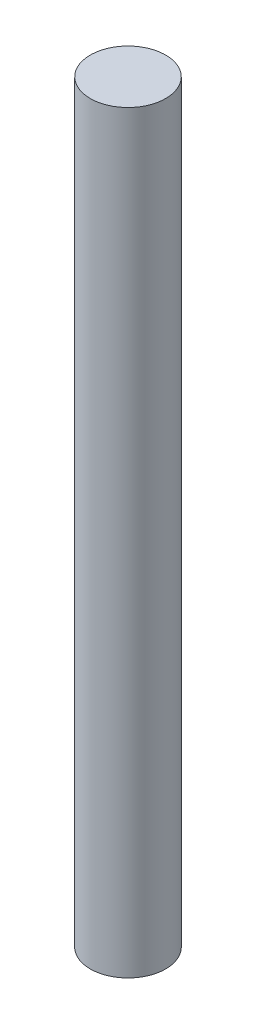
ISO-10303-21;
HEADER;
FILE_DESCRIPTION(('STEP AP214'),'2;1');
FILE_NAME('part.step','',(''),(''),'','','');
FILE_SCHEMA(('AUTOMOTIVE_DESIGN { 1 0 10303 214 1 1 1 1 }'));
ENDSEC;
DATA;
#1=APPLICATION_CONTEXT('core data for automotive mechanical design processes');
#2=APPLICATION_PROTOCOL_DEFINITION('international standard','automotive_design',2000,#1);
#3=PRODUCT_CONTEXT('',#1,'mechanical');
#4=PRODUCT('Part','Part','',(#3));
#5=PRODUCT_RELATED_PRODUCT_CATEGORY('part','',(#4));
#6=PRODUCT_DEFINITION_FORMATION('','',#4);
#7=PRODUCT_DEFINITION_CONTEXT('part definition',#1,'design');
#8=PRODUCT_DEFINITION('design','',#6,#7);
#9=PRODUCT_DEFINITION_SHAPE('','',#8);
#10=(LENGTH_UNIT() NAMED_UNIT(*) SI_UNIT(.MILLI.,.METRE.));
#11=(NAMED_UNIT(*) PLANE_ANGLE_UNIT() SI_UNIT($,.RADIAN.));
#12=(NAMED_UNIT(*) SI_UNIT($,.STERADIAN.) SOLID_ANGLE_UNIT());
#13=UNCERTAINTY_MEASURE_WITH_UNIT(LENGTH_MEASURE(1.E-05),#10,'distance_accuracy_value','');
#14=(GEOMETRIC_REPRESENTATION_CONTEXT(3) GLOBAL_UNCERTAINTY_ASSIGNED_CONTEXT((#13)) GLOBAL_UNIT_ASSIGNED_CONTEXT((#10,
#11,#12)) REPRESENTATION_CONTEXT('',''));
#15=CARTESIAN_POINT('',(0.,0.,0.));
#16=DIRECTION('',(0.,0.,1.));
#17=DIRECTION('',(1.,0.,0.));
#18=AXIS2_PLACEMENT_3D('',#15,#16,#17);
#19=CARTESIAN_POINT('',(0.,-95.25,0.));
#20=DIRECTION('',(0.,1.,0.));
#21=DIRECTION('',(0.,0.,1.));
#22=AXIS2_PLACEMENT_3D('',#19,#20,#21);
#23=CYLINDRICAL_SURFACE('',#22,4.7625);
#24=CARTESIAN_POINT('',(0.,-95.25,0.));
#25=DIRECTION('',(0.,1.,0.));
#26=DIRECTION('',(0.,0.,1.));
#27=AXIS2_PLACEMENT_3D('',#24,#25,#26);
#28=CIRCLE('',#27,4.7625);
#29=CARTESIAN_POINT('',(0.,-95.25,4.7625));
#30=VERTEX_POINT('',#29);
#31=EDGE_CURVE('E10',#30,#30,#28,.T.);
#32=ORIENTED_EDGE('',*,*,#31,.T.);
#33=EDGE_LOOP('',(#32));
#34=FACE_BOUND('',#33,.T.);
#35=CARTESIAN_POINT('',(0.,0.,0.));
#36=DIRECTION('',(0.,1.,0.));
#37=DIRECTION('',(0.,0.,1.));
#38=AXIS2_PLACEMENT_3D('',#35,#36,#37);
#39=CIRCLE('',#38,4.7625);
#40=CARTESIAN_POINT('',(0.,0.,4.7625));
#41=VERTEX_POINT('',#40);
#42=EDGE_CURVE('E40',#41,#41,#39,.T.);
#43=ORIENTED_EDGE('',*,*,#42,.F.);
#44=EDGE_LOOP('',(#43));
#45=FACE_BOUND('',#44,.T.);
#46=ADVANCED_FACE('F37',(#34,#45),#23,.T.);
#47=CARTESIAN_POINT('',(0.,-95.25,0.));
#48=DIRECTION('',(0.,1.,0.));
#49=DIRECTION('',(0.,0.,1.));
#50=AXIS2_PLACEMENT_3D('',#47,#48,#49);
#51=PLANE('',#50);
#52=ORIENTED_EDGE('',*,*,#31,.F.);
#53=EDGE_LOOP('',(#52));
#54=FACE_BOUND('',#53,.T.);
#55=ADVANCED_FACE('F54',(#54),#51,.F.);
#56=CARTESIAN_POINT('',(0.,0.,0.));
#57=DIRECTION('',(0.,1.,0.));
#58=DIRECTION('',(0.,0.,1.));
#59=AXIS2_PLACEMENT_3D('',#56,#57,#58);
#60=PLANE('',#59);
#61=ORIENTED_EDGE('',*,*,#42,.T.);
#62=EDGE_LOOP('',(#61));
#63=FACE_BOUND('',#62,.T.);
#64=ADVANCED_FACE('F51',(#63),#60,.T.);
#65=CLOSED_SHELL('',(#46,#55,#64));
#66=MANIFOLD_SOLID_BREP('B2',#65);
#67=ADVANCED_BREP_SHAPE_REPRESENTATION('',(#18,#66),#14);
#68=SHAPE_DEFINITION_REPRESENTATION(#9,#67);
ENDSEC;
END-ISO-10303-21;
